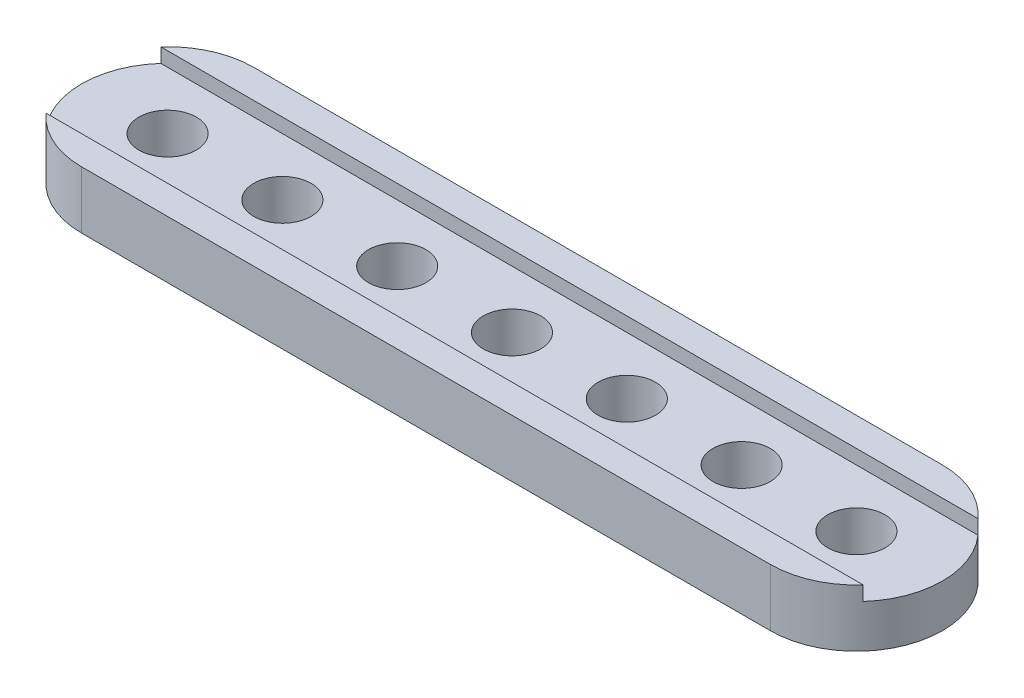
ISO-10303-21;
HEADER;
FILE_DESCRIPTION(('STEP AP214'),'2;1');
FILE_NAME('part.step','',(''),(''),'','','');
FILE_SCHEMA(('AUTOMOTIVE_DESIGN { 1 0 10303 214 1 1 1 1 }'));
ENDSEC;
DATA;
#1=APPLICATION_CONTEXT('core data for automotive mechanical design processes');
#2=APPLICATION_PROTOCOL_DEFINITION('international standard','automotive_design',2000,#1);
#3=PRODUCT_CONTEXT('',#1,'mechanical');
#4=PRODUCT('Part','Part','',(#3));
#5=PRODUCT_RELATED_PRODUCT_CATEGORY('part','',(#4));
#6=PRODUCT_DEFINITION_FORMATION('','',#4);
#7=PRODUCT_DEFINITION_CONTEXT('part definition',#1,'design');
#8=PRODUCT_DEFINITION('design','',#6,#7);
#9=PRODUCT_DEFINITION_SHAPE('','',#8);
#10=(LENGTH_UNIT() NAMED_UNIT(*) SI_UNIT(.MILLI.,.METRE.));
#11=(NAMED_UNIT(*) PLANE_ANGLE_UNIT() SI_UNIT($,.RADIAN.));
#12=(NAMED_UNIT(*) SI_UNIT($,.STERADIAN.) SOLID_ANGLE_UNIT());
#13=UNCERTAINTY_MEASURE_WITH_UNIT(LENGTH_MEASURE(1.E-05),#10,'distance_accuracy_value','');
#14=(GEOMETRIC_REPRESENTATION_CONTEXT(3) GLOBAL_UNCERTAINTY_ASSIGNED_CONTEXT((#13)) GLOBAL_UNIT_ASSIGNED_CONTEXT((#10,
#11,#12)) REPRESENTATION_CONTEXT('',''));
#15=CARTESIAN_POINT('',(0.,0.,0.));
#16=DIRECTION('',(0.,0.,1.));
#17=DIRECTION('',(1.,0.,0.));
#18=AXIS2_PLACEMENT_3D('',#15,#16,#17);
#19=CARTESIAN_POINT('',(24.,4.,0.));
#20=DIRECTION('',(0.,1.,0.));
#21=DIRECTION('',(0.,0.,1.));
#22=AXIS2_PLACEMENT_3D('',#19,#20,#21);
#23=PLANE('',#22);
#24=CARTESIAN_POINT('',(24.,4.,0.));
#25=DIRECTION('',(0.,1.,0.));
#26=DIRECTION('',(0.,0.,1.));
#27=AXIS2_PLACEMENT_3D('',#24,#25,#26);
#28=CIRCLE('',#27,5.99999999999999);
#29=CARTESIAN_POINT('',(24.,4.,5.99999999999999));
#30=VERTEX_POINT('',#29);
#31=CARTESIAN_POINT('',(28.4721359549996,4.,4.));
#32=VERTEX_POINT('',#31);
#33=EDGE_CURVE('E126',#30,#32,#28,.T.);
#34=ORIENTED_EDGE('',*,*,#33,.T.);
#35=DIRECTION('',(1.,0.,0.));
#36=VECTOR('',#35,1.);
#37=CARTESIAN_POINT('',(-32.,4.,4.));
#38=LINE('',#37,#36);
#39=CARTESIAN_POINT('',(-28.4721359549996,4.,4.));
#40=VERTEX_POINT('',#39);
#41=EDGE_CURVE('E114',#40,#32,#38,.T.);
#42=ORIENTED_EDGE('',*,*,#41,.F.);
#43=CARTESIAN_POINT('',(-24.,4.,0.));
#44=DIRECTION('',(0.,1.,0.));
#45=DIRECTION('',(0.,0.,1.));
#46=AXIS2_PLACEMENT_3D('',#43,#44,#45);
#47=CIRCLE('',#46,5.99999999999999);
#48=CARTESIAN_POINT('',(-24.,4.,6.));
#49=VERTEX_POINT('',#48);
#50=EDGE_CURVE('E134',#40,#49,#47,.T.);
#51=ORIENTED_EDGE('',*,*,#50,.T.);
#52=DIRECTION('',(1.,0.,0.));
#53=VECTOR('',#52,1.);
#54=CARTESIAN_POINT('',(24.,4.,5.99999999999999));
#55=LINE('',#54,#53);
#56=EDGE_CURVE('E55',#49,#30,#55,.T.);
#57=ORIENTED_EDGE('',*,*,#56,.T.);
#58=EDGE_LOOP('',(#34,#42,#51,#57));
#59=FACE_BOUND('',#58,.T.);
#60=ADVANCED_FACE('F38',(#59),#23,.T.);
#61=DIRECTION('',(1.,0.,0.));
#62=VECTOR('',#61,1.);
#63=CARTESIAN_POINT('',(-32.,4.,-4.));
#64=LINE('',#63,#62);
#65=CARTESIAN_POINT('',(-28.4721359549996,4.,-4.));
#66=VERTEX_POINT('',#65);
#67=CARTESIAN_POINT('',(28.4721359549996,4.,-4.));
#68=VERTEX_POINT('',#67);
#69=EDGE_CURVE('E122',#66,#68,#64,.T.);
#70=ORIENTED_EDGE('',*,*,#69,.T.);
#71=CARTESIAN_POINT('',(24.,4.,-5.99999999999999));
#72=VERTEX_POINT('',#71);
#73=EDGE_CURVE('E87',#68,#72,#28,.T.);
#74=ORIENTED_EDGE('',*,*,#73,.T.);
#75=DIRECTION('',(-1.,0.,0.));
#76=VECTOR('',#75,1.);
#77=CARTESIAN_POINT('',(24.,4.,-5.99999999999999));
#78=LINE('',#77,#76);
#79=CARTESIAN_POINT('',(-24.,4.,-5.99999999999998));
#80=VERTEX_POINT('',#79);
#81=EDGE_CURVE('E132',#72,#80,#78,.T.);
#82=ORIENTED_EDGE('',*,*,#81,.T.);
#83=EDGE_CURVE('E140',#80,#66,#47,.T.);
#84=ORIENTED_EDGE('',*,*,#83,.T.);
#85=EDGE_LOOP('',(#70,#74,#82,#84));
#86=FACE_BOUND('',#85,.T.);
#87=ADVANCED_FACE('F169',(#86),#23,.T.);
#88=CARTESIAN_POINT('',(24.,4.,0.));
#89=DIRECTION('',(0.,-1.,0.));
#90=DIRECTION('',(0.,0.,-1.));
#91=AXIS2_PLACEMENT_3D('',#88,#89,#90);
#92=CYLINDRICAL_SURFACE('',#91,5.99999999999999);
#93=DIRECTION('',(0.,-1.,0.));
#94=VECTOR('',#93,1.);
#95=CARTESIAN_POINT('',(28.4721359549996,4.,4.));
#96=LINE('',#95,#94);
#97=CARTESIAN_POINT('',(28.4721359549996,3.,4.));
#98=VERTEX_POINT('',#97);
#99=EDGE_CURVE('E118',#32,#98,#96,.T.);
#100=ORIENTED_EDGE('',*,*,#99,.F.);
#101=ORIENTED_EDGE('',*,*,#33,.F.);
#102=DIRECTION('',(0.,-1.,0.));
#103=VECTOR('',#102,1.);
#104=CARTESIAN_POINT('',(24.,4.,5.99999999999999));
#105=LINE('',#104,#103);
#106=CARTESIAN_POINT('',(24.,0.,5.99999999999999));
#107=VERTEX_POINT('',#106);
#108=EDGE_CURVE('E144',#30,#107,#105,.T.);
#109=ORIENTED_EDGE('',*,*,#108,.T.);
#110=CARTESIAN_POINT('',(24.,0.,0.));
#111=DIRECTION('',(0.,1.,0.));
#112=DIRECTION('',(0.,0.,1.));
#113=AXIS2_PLACEMENT_3D('',#110,#111,#112);
#114=CIRCLE('',#113,5.99999999999999);
#115=CARTESIAN_POINT('',(24.,0.,-5.99999999999999));
#116=VERTEX_POINT('',#115);
#117=EDGE_CURVE('E145',#107,#116,#114,.T.);
#118=ORIENTED_EDGE('',*,*,#117,.T.);
#119=DIRECTION('',(0.,-1.,0.));
#120=VECTOR('',#119,1.);
#121=CARTESIAN_POINT('',(24.,4.,-5.99999999999999));
#122=LINE('',#121,#120);
#123=EDGE_CURVE('E157',#72,#116,#122,.T.);
#124=ORIENTED_EDGE('',*,*,#123,.F.);
#125=ORIENTED_EDGE('',*,*,#73,.F.);
#126=DIRECTION('',(0.,-1.,0.));
#127=VECTOR('',#126,1.);
#128=CARTESIAN_POINT('',(28.4721359549996,4.,-4.));
#129=LINE('',#128,#127);
#130=CARTESIAN_POINT('',(28.4721359549996,3.,-4.));
#131=VERTEX_POINT('',#130);
#132=EDGE_CURVE('E278',#131,#68,#129,.F.);
#133=ORIENTED_EDGE('',*,*,#132,.F.);
#134=CARTESIAN_POINT('',(24.,3.,0.));
#135=DIRECTION('',(0.,1.,0.));
#136=DIRECTION('',(0.,0.,1.));
#137=AXIS2_PLACEMENT_3D('',#134,#135,#136);
#138=CIRCLE('',#137,5.99999999999999);
#139=EDGE_CURVE('E129',#98,#131,#138,.T.);
#140=ORIENTED_EDGE('',*,*,#139,.F.);
#141=EDGE_LOOP('',(#100,#101,#109,#118,#124,#125,#133,#140));
#142=FACE_BOUND('',#141,.T.);
#143=ADVANCED_FACE('F40',(#142),#92,.T.);
#144=CARTESIAN_POINT('',(0.,4.,0.));
#145=DIRECTION('',(0.,-1.,0.));
#146=DIRECTION('',(0.,0.,-1.));
#147=AXIS2_PLACEMENT_3D('',#144,#145,#146);
#148=CYLINDRICAL_SURFACE('',#147,2.);
#149=CARTESIAN_POINT('',(0.,0.,0.));
#150=DIRECTION('',(0.,1.,0.));
#151=DIRECTION('',(0.,0.,1.));
#152=AXIS2_PLACEMENT_3D('',#149,#150,#151);
#153=CIRCLE('',#152,2.);
#154=CARTESIAN_POINT('',(0.,0.,2.));
#155=VERTEX_POINT('',#154);
#156=EDGE_CURVE('E243',#155,#155,#153,.T.);
#157=ORIENTED_EDGE('',*,*,#156,.F.);
#158=EDGE_LOOP('',(#157));
#159=FACE_BOUND('',#158,.T.);
#160=CARTESIAN_POINT('',(0.,3.,0.));
#161=DIRECTION('',(0.,-1.,0.));
#162=DIRECTION('',(0.,0.,-1.));
#163=AXIS2_PLACEMENT_3D('',#160,#161,#162);
#164=CIRCLE('',#163,2.);
#165=CARTESIAN_POINT('',(0.,3.,-2.));
#166=VERTEX_POINT('',#165);
#167=EDGE_CURVE('E160',#166,#166,#164,.T.);
#168=ORIENTED_EDGE('',*,*,#167,.F.);
#169=EDGE_LOOP('',(#168));
#170=FACE_BOUND('',#169,.T.);
#171=ADVANCED_FACE('F220',(#159,#170),#148,.F.);
#172=CARTESIAN_POINT('',(8.00000000000001,4.,0.));
#173=DIRECTION('',(0.,-1.,0.));
#174=DIRECTION('',(0.,0.,-1.));
#175=AXIS2_PLACEMENT_3D('',#172,#173,#174);
#176=CYLINDRICAL_SURFACE('',#175,2.);
#177=CARTESIAN_POINT('',(8.00000000000001,0.,0.));
#178=DIRECTION('',(0.,1.,0.));
#179=DIRECTION('',(0.,0.,-1.));
#180=AXIS2_PLACEMENT_3D('',#177,#178,#179);
#181=CIRCLE('',#180,2.);
#182=CARTESIAN_POINT('',(8.00000000000001,0.,-2.00000000000001));
#183=VERTEX_POINT('',#182);
#184=EDGE_CURVE('E248',#183,#183,#181,.T.);
#185=ORIENTED_EDGE('',*,*,#184,.F.);
#186=EDGE_LOOP('',(#185));
#187=FACE_BOUND('',#186,.T.);
#188=CARTESIAN_POINT('',(8.00000000000001,3.,0.));
#189=DIRECTION('',(0.,1.,0.));
#190=DIRECTION('',(0.,0.,1.));
#191=AXIS2_PLACEMENT_3D('',#188,#189,#190);
#192=CIRCLE('',#191,2.);
#193=CARTESIAN_POINT('',(8.00000000000001,3.,1.99999999999999));
#194=VERTEX_POINT('',#193);
#195=EDGE_CURVE('E269',#194,#194,#192,.T.);
#196=ORIENTED_EDGE('',*,*,#195,.T.);
#197=EDGE_LOOP('',(#196));
#198=FACE_BOUND('',#197,.T.);
#199=ADVANCED_FACE('F210',(#187,#198),#176,.F.);
#200=CARTESIAN_POINT('',(16.,4.,0.));
#201=DIRECTION('',(0.,-1.,0.));
#202=DIRECTION('',(0.,0.,-1.));
#203=AXIS2_PLACEMENT_3D('',#200,#201,#202);
#204=CYLINDRICAL_SURFACE('',#203,2.);
#205=CARTESIAN_POINT('',(16.,0.,0.));
#206=DIRECTION('',(0.,1.,0.));
#207=DIRECTION('',(0.,0.,-1.));
#208=AXIS2_PLACEMENT_3D('',#205,#206,#207);
#209=CIRCLE('',#208,2.);
#210=CARTESIAN_POINT('',(16.,0.,-2.00000000000003));
#211=VERTEX_POINT('',#210);
#212=EDGE_CURVE('E251',#211,#211,#209,.T.);
#213=ORIENTED_EDGE('',*,*,#212,.F.);
#214=EDGE_LOOP('',(#213));
#215=FACE_BOUND('',#214,.T.);
#216=CARTESIAN_POINT('',(16.,3.,0.));
#217=DIRECTION('',(0.,1.,0.));
#218=DIRECTION('',(0.,0.,1.));
#219=AXIS2_PLACEMENT_3D('',#216,#217,#218);
#220=CIRCLE('',#219,2.);
#221=CARTESIAN_POINT('',(16.,3.,1.99999999999998));
#222=VERTEX_POINT('',#221);
#223=EDGE_CURVE('E272',#222,#222,#220,.T.);
#224=ORIENTED_EDGE('',*,*,#223,.T.);
#225=EDGE_LOOP('',(#224));
#226=FACE_BOUND('',#225,.T.);
#227=ADVANCED_FACE('F204',(#215,#226),#204,.F.);
#228=CARTESIAN_POINT('',(24.,4.,0.));
#229=DIRECTION('',(0.,-1.,0.));
#230=DIRECTION('',(0.,0.,-1.));
#231=AXIS2_PLACEMENT_3D('',#228,#229,#230);
#232=CYLINDRICAL_SURFACE('',#231,2.);
#233=CARTESIAN_POINT('',(24.,0.,0.));
#234=DIRECTION('',(0.,1.,0.));
#235=DIRECTION('',(0.,0.,-1.));
#236=AXIS2_PLACEMENT_3D('',#233,#234,#235);
#237=CIRCLE('',#236,2.);
#238=CARTESIAN_POINT('',(24.,0.,-2.00000000000004));
#239=VERTEX_POINT('',#238);
#240=EDGE_CURVE('E254',#239,#239,#237,.T.);
#241=ORIENTED_EDGE('',*,*,#240,.F.);
#242=EDGE_LOOP('',(#241));
#243=FACE_BOUND('',#242,.T.);
#244=CARTESIAN_POINT('',(24.,3.,0.));
#245=DIRECTION('',(0.,1.,0.));
#246=DIRECTION('',(0.,0.,1.));
#247=AXIS2_PLACEMENT_3D('',#244,#245,#246);
#248=CIRCLE('',#247,2.);
#249=CARTESIAN_POINT('',(24.,3.,1.99999999999996));
#250=VERTEX_POINT('',#249);
#251=EDGE_CURVE('E275',#250,#250,#248,.T.);
#252=ORIENTED_EDGE('',*,*,#251,.T.);
#253=EDGE_LOOP('',(#252));
#254=FACE_BOUND('',#253,.T.);
#255=ADVANCED_FACE('F199',(#243,#254),#232,.F.);
#256=CARTESIAN_POINT('',(24.,0.,0.));
#257=DIRECTION('',(0.,1.,0.));
#258=DIRECTION('',(0.,0.,1.));
#259=AXIS2_PLACEMENT_3D('',#256,#257,#258);
#260=PLANE('',#259);
#261=ORIENTED_EDGE('',*,*,#117,.F.);
#262=DIRECTION('',(1.,0.,0.));
#263=VECTOR('',#262,1.);
#264=CARTESIAN_POINT('',(24.,0.,5.99999999999999));
#265=LINE('',#264,#263);
#266=CARTESIAN_POINT('',(-24.,0.,6.));
#267=VERTEX_POINT('',#266);
#268=EDGE_CURVE('E79',#267,#107,#265,.T.);
#269=ORIENTED_EDGE('',*,*,#268,.F.);
#270=CARTESIAN_POINT('',(-24.,0.,0.));
#271=DIRECTION('',(0.,1.,0.));
#272=DIRECTION('',(0.,0.,1.));
#273=AXIS2_PLACEMENT_3D('',#270,#271,#272);
#274=CIRCLE('',#273,5.99999999999999);
#275=CARTESIAN_POINT('',(-24.,0.,-5.99999999999998));
#276=VERTEX_POINT('',#275);
#277=EDGE_CURVE('E73',#276,#267,#274,.T.);
#278=ORIENTED_EDGE('',*,*,#277,.F.);
#279=DIRECTION('',(-1.,0.,0.));
#280=VECTOR('',#279,1.);
#281=CARTESIAN_POINT('',(24.,0.,-5.99999999999999));
#282=LINE('',#281,#280);
#283=EDGE_CURVE('E148',#116,#276,#282,.T.);
#284=ORIENTED_EDGE('',*,*,#283,.F.);
#285=EDGE_LOOP('',(#261,#269,#278,#284));
#286=FACE_BOUND('',#285,.T.);
#287=CARTESIAN_POINT('',(-24.,0.,0.));
#288=DIRECTION('',(0.,1.,0.));
#289=DIRECTION('',(0.,0.,1.));
#290=AXIS2_PLACEMENT_3D('',#287,#288,#289);
#291=CIRCLE('',#290,2.);
#292=CARTESIAN_POINT('',(-24.,0.,2.00000000000001));
#293=VERTEX_POINT('',#292);
#294=EDGE_CURVE('E137',#293,#293,#291,.T.);
#295=ORIENTED_EDGE('',*,*,#294,.T.);
#296=EDGE_LOOP('',(#295));
#297=FACE_BOUND('',#296,.T.);
#298=CARTESIAN_POINT('',(-16.,0.,0.));
#299=DIRECTION('',(0.,1.,0.));
#300=DIRECTION('',(0.,0.,1.));
#301=AXIS2_PLACEMENT_3D('',#298,#299,#300);
#302=CIRCLE('',#301,2.);
#303=CARTESIAN_POINT('',(-16.,0.,2.00000000000001));
#304=VERTEX_POINT('',#303);
#305=EDGE_CURVE('E238',#304,#304,#302,.T.);
#306=ORIENTED_EDGE('',*,*,#305,.T.);
#307=EDGE_LOOP('',(#306));
#308=FACE_BOUND('',#307,.T.);
#309=CARTESIAN_POINT('',(-8.,0.,0.));
#310=DIRECTION('',(0.,1.,0.));
#311=DIRECTION('',(0.,0.,1.));
#312=AXIS2_PLACEMENT_3D('',#309,#310,#311);
#313=CIRCLE('',#312,2.);
#314=CARTESIAN_POINT('',(-8.,0.,2.));
#315=VERTEX_POINT('',#314);
#316=EDGE_CURVE('E240',#315,#315,#313,.T.);
#317=ORIENTED_EDGE('',*,*,#316,.T.);
#318=EDGE_LOOP('',(#317));
#319=FACE_BOUND('',#318,.T.);
#320=ORIENTED_EDGE('',*,*,#156,.T.);
#321=EDGE_LOOP('',(#320));
#322=FACE_BOUND('',#321,.T.);
#323=ORIENTED_EDGE('',*,*,#184,.T.);
#324=EDGE_LOOP('',(#323));
#325=FACE_BOUND('',#324,.T.);
#326=ORIENTED_EDGE('',*,*,#212,.T.);
#327=EDGE_LOOP('',(#326));
#328=FACE_BOUND('',#327,.T.);
#329=ORIENTED_EDGE('',*,*,#240,.T.);
#330=EDGE_LOOP('',(#329));
#331=FACE_BOUND('',#330,.T.);
#332=ADVANCED_FACE('F177',(#286,#297,#308,#319,#322,#325,#328,#331),#260,.F.);
#333=CARTESIAN_POINT('',(24.,4.,-5.99999999999999));
#334=DIRECTION('',(0.,0.,1.));
#335=DIRECTION('',(1.,0.,0.));
#336=AXIS2_PLACEMENT_3D('',#333,#334,#335);
#337=PLANE('',#336);
#338=ORIENTED_EDGE('',*,*,#283,.T.);
#339=DIRECTION('',(0.,-1.,0.));
#340=VECTOR('',#339,1.);
#341=CARTESIAN_POINT('',(-24.,4.,-5.99999999999998));
#342=LINE('',#341,#340);
#343=EDGE_CURVE('E155',#80,#276,#342,.T.);
#344=ORIENTED_EDGE('',*,*,#343,.F.);
#345=ORIENTED_EDGE('',*,*,#81,.F.);
#346=ORIENTED_EDGE('',*,*,#123,.T.);
#347=EDGE_LOOP('',(#338,#344,#345,#346));
#348=FACE_BOUND('',#347,.T.);
#349=ADVANCED_FACE('F174',(#348),#337,.F.);
#350=CARTESIAN_POINT('',(-24.,4.,0.));
#351=DIRECTION('',(0.,-1.,0.));
#352=DIRECTION('',(0.,0.,-1.));
#353=AXIS2_PLACEMENT_3D('',#350,#351,#352);
#354=CYLINDRICAL_SURFACE('',#353,5.99999999999999);
#355=ORIENTED_EDGE('',*,*,#50,.F.);
#356=DIRECTION('',(0.,-1.,0.));
#357=VECTOR('',#356,1.);
#358=CARTESIAN_POINT('',(-28.4721359549996,4.,4.));
#359=LINE('',#358,#357);
#360=CARTESIAN_POINT('',(-28.4721359549996,3.,4.));
#361=VERTEX_POINT('',#360);
#362=EDGE_CURVE('E11',#40,#361,#359,.T.);
#363=ORIENTED_EDGE('',*,*,#362,.T.);
#364=CARTESIAN_POINT('',(-24.,3.,0.));
#365=DIRECTION('',(0.,-1.,0.));
#366=DIRECTION('',(0.,0.,-1.));
#367=AXIS2_PLACEMENT_3D('',#364,#365,#366);
#368=CIRCLE('',#367,5.99999999999999);
#369=CARTESIAN_POINT('',(-28.4721359549996,3.,-4.));
#370=VERTEX_POINT('',#369);
#371=EDGE_CURVE('E166',#361,#370,#368,.T.);
#372=ORIENTED_EDGE('',*,*,#371,.T.);
#373=DIRECTION('',(0.,-1.,0.));
#374=VECTOR('',#373,1.);
#375=CARTESIAN_POINT('',(-28.4721359549996,4.,-4.));
#376=LINE('',#375,#374);
#377=EDGE_CURVE('E47',#370,#66,#376,.F.);
#378=ORIENTED_EDGE('',*,*,#377,.T.);
#379=ORIENTED_EDGE('',*,*,#83,.F.);
#380=ORIENTED_EDGE('',*,*,#343,.T.);
#381=ORIENTED_EDGE('',*,*,#277,.T.);
#382=DIRECTION('',(0.,-1.,0.));
#383=VECTOR('',#382,1.);
#384=CARTESIAN_POINT('',(-24.,4.,6.));
#385=LINE('',#384,#383);
#386=EDGE_CURVE('E153',#49,#267,#385,.T.);
#387=ORIENTED_EDGE('',*,*,#386,.F.);
#388=EDGE_LOOP('',(#355,#363,#372,#378,#379,#380,#381,#387));
#389=FACE_BOUND('',#388,.T.);
#390=ADVANCED_FACE('F165',(#389),#354,.T.);
#391=CARTESIAN_POINT('',(24.,4.,5.99999999999999));
#392=DIRECTION('',(0.,0.,-1.));
#393=DIRECTION('',(-1.,0.,0.));
#394=AXIS2_PLACEMENT_3D('',#391,#392,#393);
#395=PLANE('',#394);
#396=ORIENTED_EDGE('',*,*,#268,.T.);
#397=ORIENTED_EDGE('',*,*,#108,.F.);
#398=ORIENTED_EDGE('',*,*,#56,.F.);
#399=ORIENTED_EDGE('',*,*,#386,.T.);
#400=EDGE_LOOP('',(#396,#397,#398,#399));
#401=FACE_BOUND('',#400,.T.);
#402=ADVANCED_FACE('F179',(#401),#395,.F.);
#403=CARTESIAN_POINT('',(-24.,4.,0.));
#404=DIRECTION('',(0.,-1.,0.));
#405=DIRECTION('',(0.,0.,-1.));
#406=AXIS2_PLACEMENT_3D('',#403,#404,#405);
#407=CYLINDRICAL_SURFACE('',#406,2.);
#408=CARTESIAN_POINT('',(-24.,3.,0.));
#409=DIRECTION('',(0.,-1.,0.));
#410=DIRECTION('',(0.,0.,-1.));
#411=AXIS2_PLACEMENT_3D('',#408,#409,#410);
#412=CIRCLE('',#411,2.);
#413=CARTESIAN_POINT('',(-24.,3.,-2.));
#414=VERTEX_POINT('',#413);
#415=EDGE_CURVE('E258',#414,#414,#412,.T.);
#416=ORIENTED_EDGE('',*,*,#415,.F.);
#417=EDGE_LOOP('',(#416));
#418=FACE_BOUND('',#417,.T.);
#419=ORIENTED_EDGE('',*,*,#294,.F.);
#420=EDGE_LOOP('',(#419));
#421=FACE_BOUND('',#420,.T.);
#422=ADVANCED_FACE('F181',(#418,#421),#407,.F.);
#423=CARTESIAN_POINT('',(-16.,4.,0.));
#424=DIRECTION('',(0.,-1.,0.));
#425=DIRECTION('',(0.,0.,-1.));
#426=AXIS2_PLACEMENT_3D('',#423,#424,#425);
#427=CYLINDRICAL_SURFACE('',#426,2.);
#428=CARTESIAN_POINT('',(-16.,3.,0.));
#429=DIRECTION('',(0.,-1.,0.));
#430=DIRECTION('',(0.,0.,-1.));
#431=AXIS2_PLACEMENT_3D('',#428,#429,#430);
#432=CIRCLE('',#431,2.);
#433=CARTESIAN_POINT('',(-16.,3.,-1.99999999999999));
#434=VERTEX_POINT('',#433);
#435=EDGE_CURVE('E235',#434,#434,#432,.T.);
#436=ORIENTED_EDGE('',*,*,#435,.F.);
#437=EDGE_LOOP('',(#436));
#438=FACE_BOUND('',#437,.T.);
#439=ORIENTED_EDGE('',*,*,#305,.F.);
#440=EDGE_LOOP('',(#439));
#441=FACE_BOUND('',#440,.T.);
#442=ADVANCED_FACE('F187',(#438,#441),#427,.F.);
#443=CARTESIAN_POINT('',(-8.,4.,0.));
#444=DIRECTION('',(0.,-1.,0.));
#445=DIRECTION('',(0.,0.,-1.));
#446=AXIS2_PLACEMENT_3D('',#443,#444,#445);
#447=CYLINDRICAL_SURFACE('',#446,2.);
#448=CARTESIAN_POINT('',(-8.,3.,0.));
#449=DIRECTION('',(0.,-1.,0.));
#450=DIRECTION('',(0.,0.,-1.));
#451=AXIS2_PLACEMENT_3D('',#448,#449,#450);
#452=CIRCLE('',#451,2.);
#453=CARTESIAN_POINT('',(-8.,3.,-2.));
#454=VERTEX_POINT('',#453);
#455=EDGE_CURVE('E121',#454,#454,#452,.T.);
#456=ORIENTED_EDGE('',*,*,#455,.F.);
#457=EDGE_LOOP('',(#456));
#458=FACE_BOUND('',#457,.T.);
#459=ORIENTED_EDGE('',*,*,#316,.F.);
#460=EDGE_LOOP('',(#459));
#461=FACE_BOUND('',#460,.T.);
#462=ADVANCED_FACE('F225',(#458,#461),#447,.F.);
#463=CARTESIAN_POINT('',(-32.,3.,4.));
#464=DIRECTION('',(0.,0.,1.));
#465=DIRECTION('',(1.,0.,0.));
#466=AXIS2_PLACEMENT_3D('',#463,#464,#465);
#467=PLANE('',#466);
#468=ORIENTED_EDGE('',*,*,#41,.T.);
#469=ORIENTED_EDGE('',*,*,#99,.T.);
#470=DIRECTION('',(1.,0.,0.));
#471=VECTOR('',#470,1.);
#472=CARTESIAN_POINT('',(-32.,3.,4.));
#473=LINE('',#472,#471);
#474=EDGE_CURVE('E130',#361,#98,#473,.T.);
#475=ORIENTED_EDGE('',*,*,#474,.F.);
#476=ORIENTED_EDGE('',*,*,#362,.F.);
#477=EDGE_LOOP('',(#468,#469,#475,#476));
#478=FACE_BOUND('',#477,.T.);
#479=ADVANCED_FACE('F116',(#478),#467,.F.);
#480=CARTESIAN_POINT('',(-32.,3.,-4.));
#481=DIRECTION('',(0.,0.,-1.));
#482=DIRECTION('',(-1.,0.,0.));
#483=AXIS2_PLACEMENT_3D('',#480,#481,#482);
#484=PLANE('',#483);
#485=DIRECTION('',(1.,0.,0.));
#486=VECTOR('',#485,1.);
#487=CARTESIAN_POINT('',(-32.,3.,-4.));
#488=LINE('',#487,#486);
#489=EDGE_CURVE('E265',#370,#131,#488,.T.);
#490=ORIENTED_EDGE('',*,*,#489,.T.);
#491=ORIENTED_EDGE('',*,*,#132,.T.);
#492=ORIENTED_EDGE('',*,*,#69,.F.);
#493=ORIENTED_EDGE('',*,*,#377,.F.);
#494=EDGE_LOOP('',(#490,#491,#492,#493));
#495=FACE_BOUND('',#494,.T.);
#496=ADVANCED_FACE('F279',(#495),#484,.F.);
#497=CARTESIAN_POINT('',(-32.,3.,-4.));
#498=DIRECTION('',(0.,-1.,0.));
#499=DIRECTION('',(0.,0.,-1.));
#500=AXIS2_PLACEMENT_3D('',#497,#498,#499);
#501=PLANE('',#500);
#502=ORIENTED_EDGE('',*,*,#167,.T.);
#503=EDGE_LOOP('',(#502));
#504=FACE_BOUND('',#503,.T.);
#505=ORIENTED_EDGE('',*,*,#415,.T.);
#506=EDGE_LOOP('',(#505));
#507=FACE_BOUND('',#506,.T.);
#508=ORIENTED_EDGE('',*,*,#435,.T.);
#509=EDGE_LOOP('',(#508));
#510=FACE_BOUND('',#509,.T.);
#511=ORIENTED_EDGE('',*,*,#455,.T.);
#512=EDGE_LOOP('',(#511));
#513=FACE_BOUND('',#512,.T.);
#514=ORIENTED_EDGE('',*,*,#474,.T.);
#515=ORIENTED_EDGE('',*,*,#139,.T.);
#516=ORIENTED_EDGE('',*,*,#489,.F.);
#517=ORIENTED_EDGE('',*,*,#371,.F.);
#518=EDGE_LOOP('',(#514,#515,#516,#517));
#519=FACE_BOUND('',#518,.T.);
#520=ORIENTED_EDGE('',*,*,#251,.F.);
#521=EDGE_LOOP('',(#520));
#522=FACE_BOUND('',#521,.T.);
#523=ORIENTED_EDGE('',*,*,#223,.F.);
#524=EDGE_LOOP('',(#523));
#525=FACE_BOUND('',#524,.T.);
#526=ORIENTED_EDGE('',*,*,#195,.F.);
#527=EDGE_LOOP('',(#526));
#528=FACE_BOUND('',#527,.T.);
#529=ADVANCED_FACE('F281',(#504,#507,#510,#513,#519,#522,#525,#528),#501,.F.);
#530=CLOSED_SHELL('',(#60,#87,#143,#171,#199,#227,#255,#332,#349,#390,#402,#422,#442,#462,#479,
#496,#529));
#531=MANIFOLD_SOLID_BREP('B2',#530);
#532=ADVANCED_BREP_SHAPE_REPRESENTATION('',(#18,#531),#14);
#533=SHAPE_DEFINITION_REPRESENTATION(#9,#532);
ENDSEC;
END-ISO-10303-21;
